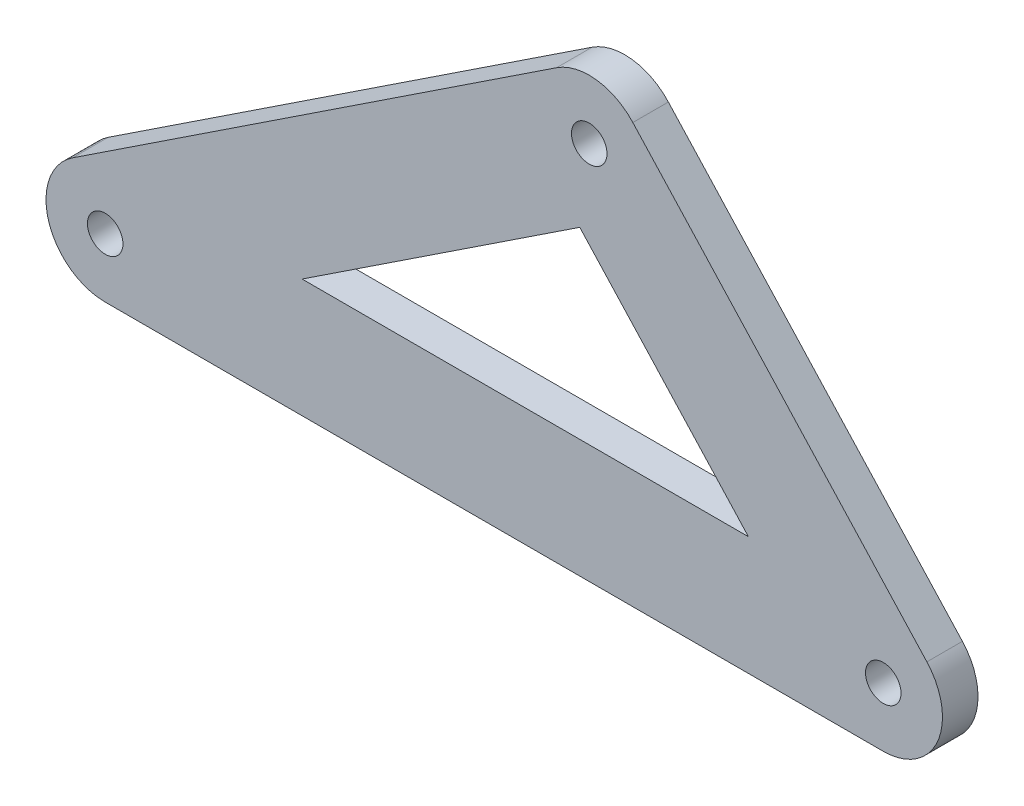
ISO-10303-21;
HEADER;
FILE_DESCRIPTION(('STEP AP214'),'2;1');
FILE_NAME('part.step','',(''),(''),'','','');
FILE_SCHEMA(('AUTOMOTIVE_DESIGN { 1 0 10303 214 1 1 1 1 }'));
ENDSEC;
DATA;
#1=APPLICATION_CONTEXT('core data for automotive mechanical design processes');
#2=APPLICATION_PROTOCOL_DEFINITION('international standard','automotive_design',2000,#1);
#3=PRODUCT_CONTEXT('',#1,'mechanical');
#4=PRODUCT('Part','Part','',(#3));
#5=PRODUCT_RELATED_PRODUCT_CATEGORY('part','',(#4));
#6=PRODUCT_DEFINITION_FORMATION('','',#4);
#7=PRODUCT_DEFINITION_CONTEXT('part definition',#1,'design');
#8=PRODUCT_DEFINITION('design','',#6,#7);
#9=PRODUCT_DEFINITION_SHAPE('','',#8);
#10=(LENGTH_UNIT() NAMED_UNIT(*) SI_UNIT(.MILLI.,.METRE.));
#11=(NAMED_UNIT(*) PLANE_ANGLE_UNIT() SI_UNIT($,.RADIAN.));
#12=(NAMED_UNIT(*) SI_UNIT($,.STERADIAN.) SOLID_ANGLE_UNIT());
#13=UNCERTAINTY_MEASURE_WITH_UNIT(LENGTH_MEASURE(1.E-05),#10,'distance_accuracy_value','');
#14=(GEOMETRIC_REPRESENTATION_CONTEXT(3) GLOBAL_UNCERTAINTY_ASSIGNED_CONTEXT((#13)) GLOBAL_UNIT_ASSIGNED_CONTEXT((#10,
#11,#12)) REPRESENTATION_CONTEXT('',''));
#15=CARTESIAN_POINT('',(0.,0.,0.));
#16=DIRECTION('',(0.,0.,1.));
#17=DIRECTION('',(1.,0.,0.));
#18=AXIS2_PLACEMENT_3D('',#15,#16,#17);
#19=CARTESIAN_POINT('',(40.8721461187215,27.0271654386819,3.));
#20=DIRECTION('',(0.,0.,1.));
#21=DIRECTION('',(1.,0.,0.));
#22=AXIS2_PLACEMENT_3D('',#19,#20,#21);
#23=PLANE('',#22);
#24=CARTESIAN_POINT('',(40.8721461187215,27.0271654386819,3.));
#25=DIRECTION('',(0.,0.,1.));
#26=DIRECTION('',(1.,0.,0.));
#27=AXIS2_PLACEMENT_3D('',#24,#25,#26);
#28=CIRCLE('',#27,1.5);
#29=CARTESIAN_POINT('',(42.3721461187215,27.0271654386819,3.));
#30=VERTEX_POINT('',#29);
#31=EDGE_CURVE('E131',#30,#30,#28,.T.);
#32=ORIENTED_EDGE('',*,*,#31,.F.);
#33=EDGE_LOOP('',(#32));
#34=FACE_BOUND('',#33,.T.);
#35=CARTESIAN_POINT('',(40.8721461187215,27.0271654386819,3.));
#36=DIRECTION('',(0.,0.,1.));
#37=DIRECTION('',(1.,0.,0.));
#38=AXIS2_PLACEMENT_3D('',#35,#36,#37);
#39=CIRCLE('',#38,5.);
#40=CARTESIAN_POINT('',(44.5543212466073,30.409706839401,3.));
#41=VERTEX_POINT('',#40);
#42=CARTESIAN_POINT('',(38.1142720943661,31.1977925936535,3.));
#43=VERTEX_POINT('',#42);
#44=EDGE_CURVE('E143',#41,#43,#39,.T.);
#45=ORIENTED_EDGE('',*,*,#44,.T.);
#46=DIRECTION('',(-0.834125430994316,-0.55157480487106,0.));
#47=VECTOR('',#46,1.);
#48=CARTESIAN_POINT('',(-2.75787402435513,4.17062715497169,3.));
#49=LINE('',#48,#47);
#50=CARTESIAN_POINT('',(-2.75787402435513,4.17062715497169,3.));
#51=VERTEX_POINT('',#50);
#52=EDGE_CURVE('E146',#43,#51,#49,.T.);
#53=ORIENTED_EDGE('',*,*,#52,.T.);
#54=CARTESIAN_POINT('',(0.,0.,3.));
#55=DIRECTION('',(0.,0.,1.));
#56=DIRECTION('',(-1.,0.,0.));
#57=AXIS2_PLACEMENT_3D('',#54,#55,#56);
#58=CIRCLE('',#57,5.);
#59=CARTESIAN_POINT('',(2.0122792321331E-13,-5.,3.));
#60=VERTEX_POINT('',#59);
#61=EDGE_CURVE('E149',#51,#60,#58,.T.);
#62=ORIENTED_EDGE('',*,*,#61,.T.);
#63=DIRECTION('',(1.,0.,0.));
#64=VECTOR('',#63,1.);
#65=CARTESIAN_POINT('',(65.6999999999999,-5.,3.));
#66=LINE('',#65,#64);
#67=CARTESIAN_POINT('',(65.6999999999999,-5.,3.));
#68=VERTEX_POINT('',#67);
#69=EDGE_CURVE('E151',#60,#68,#66,.T.);
#70=ORIENTED_EDGE('',*,*,#69,.T.);
#71=CARTESIAN_POINT('',(65.7,0.,3.));
#72=DIRECTION('',(0.,0.,1.));
#73=DIRECTION('',(1.,0.,0.));
#74=AXIS2_PLACEMENT_3D('',#71,#72,#73);
#75=CIRCLE('',#74,5.);
#76=CARTESIAN_POINT('',(69.3821751278857,3.38254140071923,3.));
#77=VERTEX_POINT('',#76);
#78=EDGE_CURVE('E153',#68,#77,#75,.T.);
#79=ORIENTED_EDGE('',*,*,#78,.T.);
#80=DIRECTION('',(-0.676508280143829,0.736435025577164,0.));
#81=VECTOR('',#80,1.);
#82=CARTESIAN_POINT('',(44.5543212466073,30.409706839401,3.));
#83=LINE('',#82,#81);
#84=EDGE_CURVE('E155',#77,#41,#83,.T.);
#85=ORIENTED_EDGE('',*,*,#84,.T.);
#86=EDGE_LOOP('',(#45,#53,#62,#70,#79,#85));
#87=FACE_BOUND('',#86,.T.);
#88=CARTESIAN_POINT('',(0.,0.,3.));
#89=DIRECTION('',(0.,0.,1.));
#90=DIRECTION('',(1.,0.,0.));
#91=AXIS2_PLACEMENT_3D('',#88,#89,#90);
#92=CIRCLE('',#91,1.5);
#93=CARTESIAN_POINT('',(1.5,0.,3.));
#94=VERTEX_POINT('',#93);
#95=EDGE_CURVE('E137',#94,#94,#92,.T.);
#96=ORIENTED_EDGE('',*,*,#95,.F.);
#97=EDGE_LOOP('',(#96));
#98=FACE_BOUND('',#97,.T.);
#99=DIRECTION('',(1.,0.,0.));
#100=VECTOR('',#99,1.);
#101=CARTESIAN_POINT('',(54.3174053248628,5.,3.));
#102=LINE('',#101,#100);
#103=CARTESIAN_POINT('',(16.6262618850319,5.,3.));
#104=VERTEX_POINT('',#103);
#105=CARTESIAN_POINT('',(54.3174053248628,5.,3.));
#106=VERTEX_POINT('',#105);
#107=EDGE_CURVE('E115',#104,#106,#102,.T.);
#108=ORIENTED_EDGE('',*,*,#107,.F.);
#109=DIRECTION('',(-0.834125430994316,-0.551574804871059,0.));
#110=VECTOR('',#109,1.);
#111=CARTESIAN_POINT('',(16.6262618850319,5.,3.));
#112=LINE('',#111,#110);
#113=CARTESIAN_POINT('',(40.0740232557238,20.5050954234612,3.));
#114=VERTEX_POINT('',#113);
#115=EDGE_CURVE('E107',#114,#104,#112,.T.);
#116=ORIENTED_EDGE('',*,*,#115,.F.);
#117=DIRECTION('',(-0.676508280143829,0.736435025577164,0.));
#118=VECTOR('',#117,1.);
#119=CARTESIAN_POINT('',(40.0740232557238,20.5050954234612,3.));
#120=LINE('',#119,#118);
#121=EDGE_CURVE('E125',#106,#114,#120,.T.);
#122=ORIENTED_EDGE('',*,*,#121,.F.);
#123=EDGE_LOOP('',(#108,#116,#122));
#124=FACE_BOUND('',#123,.T.);
#125=CARTESIAN_POINT('',(65.7,0.,3.));
#126=DIRECTION('',(0.,0.,1.));
#127=DIRECTION('',(1.,0.,0.));
#128=AXIS2_PLACEMENT_3D('',#125,#126,#127);
#129=CIRCLE('',#128,1.5);
#130=CARTESIAN_POINT('',(67.2,0.,3.));
#131=VERTEX_POINT('',#130);
#132=EDGE_CURVE('E251',#131,#131,#129,.T.);
#133=ORIENTED_EDGE('',*,*,#132,.F.);
#134=EDGE_LOOP('',(#133));
#135=FACE_BOUND('',#134,.T.);
#136=ADVANCED_FACE('F36',(#34,#87,#98,#124,#135),#23,.T.);
#137=CARTESIAN_POINT('',(40.8721461187215,27.0271654386819,0.));
#138=DIRECTION('',(0.,0.,1.));
#139=DIRECTION('',(1.,0.,0.));
#140=AXIS2_PLACEMENT_3D('',#137,#138,#139);
#141=PLANE('',#140);
#142=CARTESIAN_POINT('',(0.,0.,0.));
#143=DIRECTION('',(0.,0.,1.));
#144=DIRECTION('',(1.,0.,0.));
#145=AXIS2_PLACEMENT_3D('',#142,#143,#144);
#146=CIRCLE('',#145,1.5);
#147=CARTESIAN_POINT('',(1.5,0.,0.));
#148=VERTEX_POINT('',#147);
#149=EDGE_CURVE('E122',#148,#148,#146,.T.);
#150=ORIENTED_EDGE('',*,*,#149,.T.);
#151=EDGE_LOOP('',(#150));
#152=FACE_BOUND('',#151,.T.);
#153=CARTESIAN_POINT('',(40.8721461187215,27.0271654386819,0.));
#154=DIRECTION('',(0.,0.,1.));
#155=DIRECTION('',(1.,0.,0.));
#156=AXIS2_PLACEMENT_3D('',#153,#154,#155);
#157=CIRCLE('',#156,5.);
#158=CARTESIAN_POINT('',(44.5543212466073,30.409706839401,0.));
#159=VERTEX_POINT('',#158);
#160=CARTESIAN_POINT('',(38.1142720943661,31.1977925936535,0.));
#161=VERTEX_POINT('',#160);
#162=EDGE_CURVE('E140',#159,#161,#157,.T.);
#163=ORIENTED_EDGE('',*,*,#162,.F.);
#164=DIRECTION('',(-0.676508280143829,0.736435025577164,0.));
#165=VECTOR('',#164,1.);
#166=CARTESIAN_POINT('',(44.5543212466073,30.409706839401,0.));
#167=LINE('',#166,#165);
#168=CARTESIAN_POINT('',(69.3821751278857,3.38254140071923,0.));
#169=VERTEX_POINT('',#168);
#170=EDGE_CURVE('E147',#169,#159,#167,.T.);
#171=ORIENTED_EDGE('',*,*,#170,.F.);
#172=CARTESIAN_POINT('',(65.7,0.,0.));
#173=DIRECTION('',(0.,0.,1.));
#174=DIRECTION('',(1.,0.,0.));
#175=AXIS2_PLACEMENT_3D('',#172,#173,#174);
#176=CIRCLE('',#175,5.);
#177=CARTESIAN_POINT('',(65.6999999999999,-5.,0.));
#178=VERTEX_POINT('',#177);
#179=EDGE_CURVE('E166',#178,#169,#176,.T.);
#180=ORIENTED_EDGE('',*,*,#179,.F.);
#181=DIRECTION('',(1.,0.,0.));
#182=VECTOR('',#181,1.);
#183=CARTESIAN_POINT('',(65.6999999999999,-5.,0.));
#184=LINE('',#183,#182);
#185=CARTESIAN_POINT('',(2.0122792321331E-13,-5.,0.));
#186=VERTEX_POINT('',#185);
#187=EDGE_CURVE('E164',#186,#178,#184,.T.);
#188=ORIENTED_EDGE('',*,*,#187,.F.);
#189=CARTESIAN_POINT('',(0.,0.,0.));
#190=DIRECTION('',(0.,0.,1.));
#191=DIRECTION('',(-1.,0.,0.));
#192=AXIS2_PLACEMENT_3D('',#189,#190,#191);
#193=CIRCLE('',#192,5.);
#194=CARTESIAN_POINT('',(-2.75787402435513,4.17062715497169,0.));
#195=VERTEX_POINT('',#194);
#196=EDGE_CURVE('E162',#195,#186,#193,.T.);
#197=ORIENTED_EDGE('',*,*,#196,.F.);
#198=DIRECTION('',(-0.834125430994316,-0.55157480487106,0.));
#199=VECTOR('',#198,1.);
#200=CARTESIAN_POINT('',(-2.75787402435513,4.17062715497169,0.));
#201=LINE('',#200,#199);
#202=EDGE_CURVE('E160',#161,#195,#201,.T.);
#203=ORIENTED_EDGE('',*,*,#202,.F.);
#204=EDGE_LOOP('',(#163,#171,#180,#188,#197,#203));
#205=FACE_BOUND('',#204,.T.);
#206=DIRECTION('',(-0.834125430994316,-0.551574804871059,0.));
#207=VECTOR('',#206,1.);
#208=CARTESIAN_POINT('',(16.6262618850319,5.,0.));
#209=LINE('',#208,#207);
#210=CARTESIAN_POINT('',(40.0740232557238,20.5050954234612,0.));
#211=VERTEX_POINT('',#210);
#212=CARTESIAN_POINT('',(16.6262618850319,5.,0.));
#213=VERTEX_POINT('',#212);
#214=EDGE_CURVE('E59',#211,#213,#209,.T.);
#215=ORIENTED_EDGE('',*,*,#214,.T.);
#216=DIRECTION('',(1.,0.,0.));
#217=VECTOR('',#216,1.);
#218=CARTESIAN_POINT('',(54.3174053248628,5.,0.));
#219=LINE('',#218,#217);
#220=CARTESIAN_POINT('',(54.3174053248628,5.,0.));
#221=VERTEX_POINT('',#220);
#222=EDGE_CURVE('E121',#213,#221,#219,.T.);
#223=ORIENTED_EDGE('',*,*,#222,.T.);
#224=DIRECTION('',(-0.676508280143829,0.736435025577164,0.));
#225=VECTOR('',#224,1.);
#226=CARTESIAN_POINT('',(40.0740232557238,20.5050954234612,0.));
#227=LINE('',#226,#225);
#228=EDGE_CURVE('E116',#221,#211,#227,.T.);
#229=ORIENTED_EDGE('',*,*,#228,.T.);
#230=EDGE_LOOP('',(#215,#223,#229));
#231=FACE_BOUND('',#230,.T.);
#232=CARTESIAN_POINT('',(40.8721461187215,27.0271654386819,0.));
#233=DIRECTION('',(0.,0.,1.));
#234=DIRECTION('',(1.,0.,0.));
#235=AXIS2_PLACEMENT_3D('',#232,#233,#234);
#236=CIRCLE('',#235,1.5);
#237=CARTESIAN_POINT('',(42.3721461187215,27.0271654386819,0.));
#238=VERTEX_POINT('',#237);
#239=EDGE_CURVE('E257',#238,#238,#236,.T.);
#240=ORIENTED_EDGE('',*,*,#239,.T.);
#241=EDGE_LOOP('',(#240));
#242=FACE_BOUND('',#241,.T.);
#243=CARTESIAN_POINT('',(65.7,0.,0.));
#244=DIRECTION('',(0.,0.,1.));
#245=DIRECTION('',(1.,0.,0.));
#246=AXIS2_PLACEMENT_3D('',#243,#244,#245);
#247=CIRCLE('',#246,1.5);
#248=CARTESIAN_POINT('',(67.2,0.,0.));
#249=VERTEX_POINT('',#248);
#250=EDGE_CURVE('E254',#249,#249,#247,.T.);
#251=ORIENTED_EDGE('',*,*,#250,.T.);
#252=EDGE_LOOP('',(#251));
#253=FACE_BOUND('',#252,.T.);
#254=ADVANCED_FACE('F190',(#152,#205,#231,#242,#253),#141,.F.);
#255=CARTESIAN_POINT('',(40.8721461187215,27.0271654386819,3.));
#256=DIRECTION('',(0.,0.,-1.));
#257=DIRECTION('',(-1.,0.,0.));
#258=AXIS2_PLACEMENT_3D('',#255,#256,#257);
#259=CYLINDRICAL_SURFACE('',#258,5.);
#260=ORIENTED_EDGE('',*,*,#162,.T.);
#261=DIRECTION('',(0.,0.,-1.));
#262=VECTOR('',#261,1.);
#263=CARTESIAN_POINT('',(38.1142720943661,31.1977925936535,3.));
#264=LINE('',#263,#262);
#265=EDGE_CURVE('E11',#43,#161,#264,.T.);
#266=ORIENTED_EDGE('',*,*,#265,.F.);
#267=ORIENTED_EDGE('',*,*,#44,.F.);
#268=DIRECTION('',(0.,0.,-1.));
#269=VECTOR('',#268,1.);
#270=CARTESIAN_POINT('',(44.5543212466073,30.409706839401,3.));
#271=LINE('',#270,#269);
#272=EDGE_CURVE('E157',#41,#159,#271,.T.);
#273=ORIENTED_EDGE('',*,*,#272,.T.);
#274=EDGE_LOOP('',(#260,#266,#267,#273));
#275=FACE_BOUND('',#274,.T.);
#276=ADVANCED_FACE('F38',(#275),#259,.T.);
#277=CARTESIAN_POINT('',(-2.75787402435513,4.17062715497169,3.));
#278=DIRECTION('',(0.551574804871059,-0.834125430994315,0.));
#279=DIRECTION('',(0.834125430994316,0.55157480487106,0.));
#280=AXIS2_PLACEMENT_3D('',#277,#278,#279);
#281=PLANE('',#280);
#282=ORIENTED_EDGE('',*,*,#202,.T.);
#283=DIRECTION('',(0.,0.,-1.));
#284=VECTOR('',#283,1.);
#285=CARTESIAN_POINT('',(-2.75787402435513,4.17062715497169,3.));
#286=LINE('',#285,#284);
#287=EDGE_CURVE('E44',#51,#195,#286,.T.);
#288=ORIENTED_EDGE('',*,*,#287,.F.);
#289=ORIENTED_EDGE('',*,*,#52,.F.);
#290=ORIENTED_EDGE('',*,*,#265,.T.);
#291=EDGE_LOOP('',(#282,#288,#289,#290));
#292=FACE_BOUND('',#291,.T.);
#293=ADVANCED_FACE('F208',(#292),#281,.F.);
#294=CARTESIAN_POINT('',(0.,0.,3.));
#295=DIRECTION('',(0.,0.,-1.));
#296=DIRECTION('',(-1.,0.,0.));
#297=AXIS2_PLACEMENT_3D('',#294,#295,#296);
#298=CYLINDRICAL_SURFACE('',#297,5.);
#299=ORIENTED_EDGE('',*,*,#196,.T.);
#300=DIRECTION('',(0.,0.,-1.));
#301=VECTOR('',#300,1.);
#302=CARTESIAN_POINT('',(2.0122792321331E-13,-5.,3.));
#303=LINE('',#302,#301);
#304=EDGE_CURVE('E177',#60,#186,#303,.T.);
#305=ORIENTED_EDGE('',*,*,#304,.F.);
#306=ORIENTED_EDGE('',*,*,#61,.F.);
#307=ORIENTED_EDGE('',*,*,#287,.T.);
#308=EDGE_LOOP('',(#299,#305,#306,#307));
#309=FACE_BOUND('',#308,.T.);
#310=ADVANCED_FACE('F184',(#309),#298,.T.);
#311=CARTESIAN_POINT('',(65.6999999999999,-5.,3.));
#312=DIRECTION('',(0.,1.,0.));
#313=DIRECTION('',(-1.,0.,0.));
#314=AXIS2_PLACEMENT_3D('',#311,#312,#313);
#315=PLANE('',#314);
#316=ORIENTED_EDGE('',*,*,#187,.T.);
#317=DIRECTION('',(0.,0.,-1.));
#318=VECTOR('',#317,1.);
#319=CARTESIAN_POINT('',(65.6999999999999,-5.,3.));
#320=LINE('',#319,#318);
#321=EDGE_CURVE('E174',#68,#178,#320,.T.);
#322=ORIENTED_EDGE('',*,*,#321,.F.);
#323=ORIENTED_EDGE('',*,*,#69,.F.);
#324=ORIENTED_EDGE('',*,*,#304,.T.);
#325=EDGE_LOOP('',(#316,#322,#323,#324));
#326=FACE_BOUND('',#325,.T.);
#327=ADVANCED_FACE('F196',(#326),#315,.F.);
#328=CARTESIAN_POINT('',(65.7,0.,3.));
#329=DIRECTION('',(0.,0.,-1.));
#330=DIRECTION('',(-1.,0.,0.));
#331=AXIS2_PLACEMENT_3D('',#328,#329,#330);
#332=CYLINDRICAL_SURFACE('',#331,5.);
#333=ORIENTED_EDGE('',*,*,#179,.T.);
#334=DIRECTION('',(0.,0.,-1.));
#335=VECTOR('',#334,1.);
#336=CARTESIAN_POINT('',(69.3821751278857,3.38254140071923,3.));
#337=LINE('',#336,#335);
#338=EDGE_CURVE('E171',#77,#169,#337,.T.);
#339=ORIENTED_EDGE('',*,*,#338,.F.);
#340=ORIENTED_EDGE('',*,*,#78,.F.);
#341=ORIENTED_EDGE('',*,*,#321,.T.);
#342=EDGE_LOOP('',(#333,#339,#340,#341));
#343=FACE_BOUND('',#342,.T.);
#344=ADVANCED_FACE('F200',(#343),#332,.T.);
#345=CARTESIAN_POINT('',(44.5543212466073,30.409706839401,3.));
#346=DIRECTION('',(-0.736435025577164,-0.676508280143829,0.));
#347=DIRECTION('',(0.676508280143829,-0.736435025577164,0.));
#348=AXIS2_PLACEMENT_3D('',#345,#346,#347);
#349=PLANE('',#348);
#350=ORIENTED_EDGE('',*,*,#170,.T.);
#351=ORIENTED_EDGE('',*,*,#272,.F.);
#352=ORIENTED_EDGE('',*,*,#84,.F.);
#353=ORIENTED_EDGE('',*,*,#338,.T.);
#354=EDGE_LOOP('',(#350,#351,#352,#353));
#355=FACE_BOUND('',#354,.T.);
#356=ADVANCED_FACE('F211',(#355),#349,.F.);
#357=CARTESIAN_POINT('',(0.,0.,3.));
#358=DIRECTION('',(0.,0.,-1.));
#359=DIRECTION('',(-1.,0.,0.));
#360=AXIS2_PLACEMENT_3D('',#357,#358,#359);
#361=CYLINDRICAL_SURFACE('',#360,1.5);
#362=ORIENTED_EDGE('',*,*,#95,.T.);
#363=EDGE_LOOP('',(#362));
#364=FACE_BOUND('',#363,.T.);
#365=ORIENTED_EDGE('',*,*,#149,.F.);
#366=EDGE_LOOP('',(#365));
#367=FACE_BOUND('',#366,.T.);
#368=ADVANCED_FACE('F213',(#364,#367),#361,.F.);
#369=CARTESIAN_POINT('',(16.6262618850319,5.,3.));
#370=DIRECTION('',(0.551574804871059,-0.834125430994315,0.));
#371=DIRECTION('',(0.834125430994316,0.551574804871059,0.));
#372=AXIS2_PLACEMENT_3D('',#369,#370,#371);
#373=PLANE('',#372);
#374=ORIENTED_EDGE('',*,*,#214,.F.);
#375=DIRECTION('',(0.,0.,-1.));
#376=VECTOR('',#375,1.);
#377=CARTESIAN_POINT('',(40.0740232557238,20.5050954234612,3.));
#378=LINE('',#377,#376);
#379=EDGE_CURVE('E111',#114,#211,#378,.T.);
#380=ORIENTED_EDGE('',*,*,#379,.F.);
#381=ORIENTED_EDGE('',*,*,#115,.T.);
#382=DIRECTION('',(0.,0.,-1.));
#383=VECTOR('',#382,1.);
#384=CARTESIAN_POINT('',(16.6262618850319,5.,3.));
#385=LINE('',#384,#383);
#386=EDGE_CURVE('E110',#104,#213,#385,.T.);
#387=ORIENTED_EDGE('',*,*,#386,.T.);
#388=EDGE_LOOP('',(#374,#380,#381,#387));
#389=FACE_BOUND('',#388,.T.);
#390=ADVANCED_FACE('F109',(#389),#373,.T.);
#391=CARTESIAN_POINT('',(54.3174053248628,5.,3.));
#392=DIRECTION('',(0.,1.,0.));
#393=DIRECTION('',(0.,0.,1.));
#394=AXIS2_PLACEMENT_3D('',#391,#392,#393);
#395=PLANE('',#394);
#396=ORIENTED_EDGE('',*,*,#222,.F.);
#397=ORIENTED_EDGE('',*,*,#386,.F.);
#398=ORIENTED_EDGE('',*,*,#107,.T.);
#399=DIRECTION('',(0.,0.,-1.));
#400=VECTOR('',#399,1.);
#401=CARTESIAN_POINT('',(54.3174053248628,5.,3.));
#402=LINE('',#401,#400);
#403=EDGE_CURVE('E51',#106,#221,#402,.T.);
#404=ORIENTED_EDGE('',*,*,#403,.T.);
#405=EDGE_LOOP('',(#396,#397,#398,#404));
#406=FACE_BOUND('',#405,.T.);
#407=ADVANCED_FACE('F119',(#406),#395,.T.);
#408=CARTESIAN_POINT('',(40.0740232557238,20.5050954234612,3.));
#409=DIRECTION('',(-0.736435025577164,-0.676508280143829,0.));
#410=DIRECTION('',(0.676508280143829,-0.736435025577164,0.));
#411=AXIS2_PLACEMENT_3D('',#408,#409,#410);
#412=PLANE('',#411);
#413=ORIENTED_EDGE('',*,*,#228,.F.);
#414=ORIENTED_EDGE('',*,*,#403,.F.);
#415=ORIENTED_EDGE('',*,*,#121,.T.);
#416=ORIENTED_EDGE('',*,*,#379,.T.);
#417=EDGE_LOOP('',(#413,#414,#415,#416));
#418=FACE_BOUND('',#417,.T.);
#419=ADVANCED_FACE('F236',(#418),#412,.T.);
#420=CARTESIAN_POINT('',(40.8721461187215,27.0271654386819,3.));
#421=DIRECTION('',(0.,0.,-1.));
#422=DIRECTION('',(-1.,0.,0.));
#423=AXIS2_PLACEMENT_3D('',#420,#421,#422);
#424=CYLINDRICAL_SURFACE('',#423,1.5);
#425=ORIENTED_EDGE('',*,*,#31,.T.);
#426=EDGE_LOOP('',(#425));
#427=FACE_BOUND('',#426,.T.);
#428=ORIENTED_EDGE('',*,*,#239,.F.);
#429=EDGE_LOOP('',(#428));
#430=FACE_BOUND('',#429,.T.);
#431=ADVANCED_FACE('F239',(#427,#430),#424,.F.);
#432=CARTESIAN_POINT('',(65.7,0.,3.));
#433=DIRECTION('',(0.,0.,-1.));
#434=DIRECTION('',(-1.,0.,0.));
#435=AXIS2_PLACEMENT_3D('',#432,#433,#434);
#436=CYLINDRICAL_SURFACE('',#435,1.5);
#437=ORIENTED_EDGE('',*,*,#132,.T.);
#438=EDGE_LOOP('',(#437));
#439=FACE_BOUND('',#438,.T.);
#440=ORIENTED_EDGE('',*,*,#250,.F.);
#441=EDGE_LOOP('',(#440));
#442=FACE_BOUND('',#441,.T.);
#443=ADVANCED_FACE('F242',(#439,#442),#436,.F.);
#444=CLOSED_SHELL('',(#136,#254,#276,#293,#310,#327,#344,#356,#368,#390,#407,#419,#431,#443));
#445=MANIFOLD_SOLID_BREP('B2',#444);
#446=ADVANCED_BREP_SHAPE_REPRESENTATION('',(#18,#445),#14);
#447=SHAPE_DEFINITION_REPRESENTATION(#9,#446);
ENDSEC;
END-ISO-10303-21;
